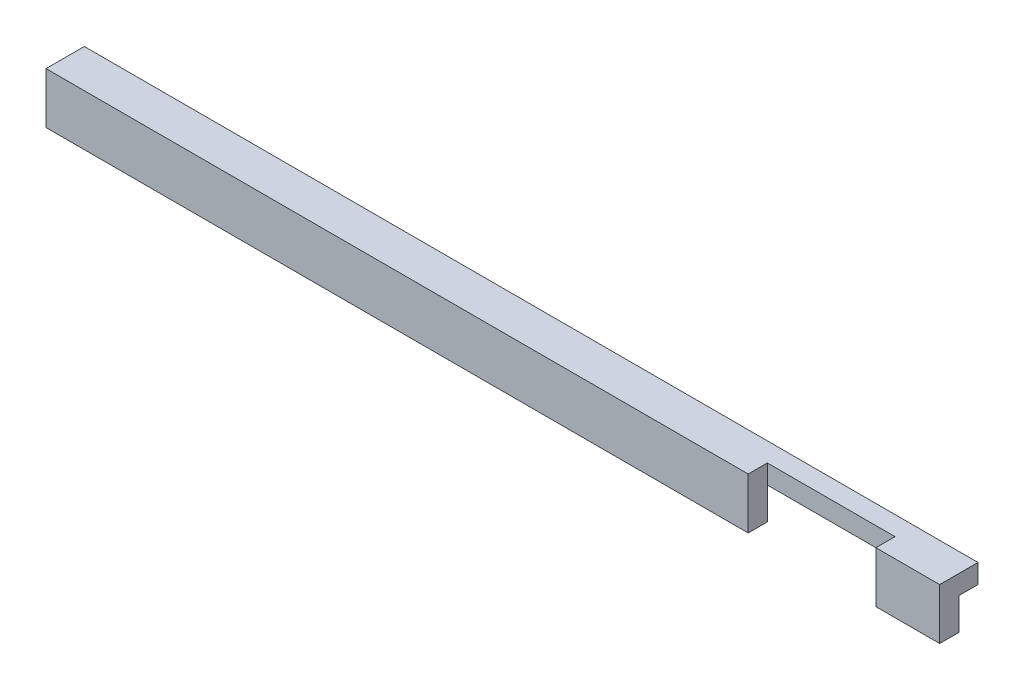
ISO-10303-21;
HEADER;
FILE_DESCRIPTION(('STEP AP214'),'2;1');
FILE_NAME('part.step','',(''),(''),'','','');
FILE_SCHEMA(('AUTOMOTIVE_DESIGN { 1 0 10303 214 1 1 1 1 }'));
ENDSEC;
DATA;
#1=APPLICATION_CONTEXT('core data for automotive mechanical design processes');
#2=APPLICATION_PROTOCOL_DEFINITION('international standard','automotive_design',2000,#1);
#3=PRODUCT_CONTEXT('',#1,'mechanical');
#4=PRODUCT('Part','Part','',(#3));
#5=PRODUCT_RELATED_PRODUCT_CATEGORY('part','',(#4));
#6=PRODUCT_DEFINITION_FORMATION('','',#4);
#7=PRODUCT_DEFINITION_CONTEXT('part definition',#1,'design');
#8=PRODUCT_DEFINITION('design','',#6,#7);
#9=PRODUCT_DEFINITION_SHAPE('','',#8);
#10=(LENGTH_UNIT() NAMED_UNIT(*) SI_UNIT(.MILLI.,.METRE.));
#11=(NAMED_UNIT(*) PLANE_ANGLE_UNIT() SI_UNIT($,.RADIAN.));
#12=(NAMED_UNIT(*) SI_UNIT($,.STERADIAN.) SOLID_ANGLE_UNIT());
#13=UNCERTAINTY_MEASURE_WITH_UNIT(LENGTH_MEASURE(1.E-05),#10,'distance_accuracy_value','');
#14=(GEOMETRIC_REPRESENTATION_CONTEXT(3) GLOBAL_UNCERTAINTY_ASSIGNED_CONTEXT((#13)) GLOBAL_UNIT_ASSIGNED_CONTEXT((#10,
#11,#12)) REPRESENTATION_CONTEXT('',''));
#15=CARTESIAN_POINT('',(0.,0.,0.));
#16=DIRECTION('',(0.,0.,1.));
#17=DIRECTION('',(1.,0.,0.));
#18=AXIS2_PLACEMENT_3D('',#15,#16,#17);
#19=CARTESIAN_POINT('',(0.,0.,0.));
#20=DIRECTION('',(0.,1.,0.));
#21=DIRECTION('',(0.,0.,1.));
#22=AXIS2_PLACEMENT_3D('',#19,#20,#21);
#23=PLANE('',#22);
#24=DIRECTION('',(1.,0.,0.));
#25=VECTOR('',#24,1.);
#26=CARTESIAN_POINT('',(-70.,0.,1.99999999999999));
#27=LINE('',#26,#25);
#28=CARTESIAN_POINT('',(60.,0.,1.99999999999999));
#29=VERTEX_POINT('',#28);
#30=CARTESIAN_POINT('',(70.,0.,1.99999999999999));
#31=VERTEX_POINT('',#30);
#32=EDGE_CURVE('E180',#29,#31,#27,.T.);
#33=ORIENTED_EDGE('',*,*,#32,.F.);
#34=DIRECTION('',(0.,0.,1.));
#35=VECTOR('',#34,1.);
#36=CARTESIAN_POINT('',(60.,0.,-1.00000000000001));
#37=LINE('',#36,#35);
#38=CARTESIAN_POINT('',(60.,0.,-1.00000000000001));
#39=VERTEX_POINT('',#38);
#40=EDGE_CURVE('E148',#39,#29,#37,.T.);
#41=ORIENTED_EDGE('',*,*,#40,.F.);
#42=DIRECTION('',(1.,0.,0.));
#43=VECTOR('',#42,1.);
#44=CARTESIAN_POINT('',(-70.,0.,-1.00000000000001));
#45=LINE('',#44,#43);
#46=CARTESIAN_POINT('',(70.,0.,-1.00000000000001));
#47=VERTEX_POINT('',#46);
#48=EDGE_CURVE('E57',#39,#47,#45,.T.);
#49=ORIENTED_EDGE('',*,*,#48,.T.);
#50=DIRECTION('',(0.,0.,-1.));
#51=VECTOR('',#50,1.);
#52=CARTESIAN_POINT('',(70.,0.,3.99999999999999));
#53=LINE('',#52,#51);
#54=EDGE_CURVE('E192',#31,#47,#53,.T.);
#55=ORIENTED_EDGE('',*,*,#54,.F.);
#56=EDGE_LOOP('',(#33,#41,#49,#55));
#57=FACE_BOUND('',#56,.T.);
#58=ADVANCED_FACE('F34',(#57),#23,.F.);
#59=CARTESIAN_POINT('',(-70.,0.,1.99999999999999));
#60=DIRECTION('',(0.,0.,-1.));
#61=DIRECTION('',(-1.,0.,0.));
#62=AXIS2_PLACEMENT_3D('',#59,#60,#61);
#63=PLANE('',#62);
#64=DIRECTION('',(1.,0.,0.));
#65=VECTOR('',#64,1.);
#66=CARTESIAN_POINT('',(-70.,8.,1.99999999999999));
#67=LINE('',#66,#65);
#68=CARTESIAN_POINT('',(60.,8.,1.99999999999999));
#69=VERTEX_POINT('',#68);
#70=CARTESIAN_POINT('',(70.,8.,1.99999999999999));
#71=VERTEX_POINT('',#70);
#72=EDGE_CURVE('E184',#69,#71,#67,.T.);
#73=ORIENTED_EDGE('',*,*,#72,.F.);
#74=DIRECTION('',(0.,1.,0.));
#75=VECTOR('',#74,1.);
#76=CARTESIAN_POINT('',(60.,8.,1.99999999999999));
#77=LINE('',#76,#75);
#78=EDGE_CURVE('E134',#29,#69,#77,.T.);
#79=ORIENTED_EDGE('',*,*,#78,.F.);
#80=ORIENTED_EDGE('',*,*,#32,.T.);
#81=DIRECTION('',(0.,1.,0.));
#82=VECTOR('',#81,1.);
#83=CARTESIAN_POINT('',(70.,0.,1.99999999999999));
#84=LINE('',#83,#82);
#85=EDGE_CURVE('E150',#31,#71,#84,.T.);
#86=ORIENTED_EDGE('',*,*,#85,.T.);
#87=EDGE_LOOP('',(#73,#79,#80,#86));
#88=FACE_BOUND('',#87,.T.);
#89=ADVANCED_FACE('F231',(#88),#63,.F.);
#90=CARTESIAN_POINT('',(-70.,0.,-1.00000000000001));
#91=DIRECTION('',(0.,0.,1.));
#92=DIRECTION('',(1.,0.,0.));
#93=AXIS2_PLACEMENT_3D('',#90,#91,#92);
#94=PLANE('',#93);
#95=ORIENTED_EDGE('',*,*,#48,.F.);
#96=DIRECTION('',(0.,1.,0.));
#97=VECTOR('',#96,1.);
#98=CARTESIAN_POINT('',(60.,8.,-1.00000000000001));
#99=LINE('',#98,#97);
#100=CARTESIAN_POINT('',(60.,5.,-1.00000000000001));
#101=VERTEX_POINT('',#100);
#102=EDGE_CURVE('E127',#39,#101,#99,.T.);
#103=ORIENTED_EDGE('',*,*,#102,.T.);
#104=DIRECTION('',(1.,0.,0.));
#105=VECTOR('',#104,1.);
#106=CARTESIAN_POINT('',(-70.,5.,-1.00000000000001));
#107=LINE('',#106,#105);
#108=CARTESIAN_POINT('',(70.,5.,-1.00000000000001));
#109=VERTEX_POINT('',#108);
#110=EDGE_CURVE('E175',#101,#109,#107,.T.);
#111=ORIENTED_EDGE('',*,*,#110,.T.);
#112=DIRECTION('',(0.,-1.,0.));
#113=VECTOR('',#112,1.);
#114=CARTESIAN_POINT('',(70.,0.,-1.00000000000001));
#115=LINE('',#114,#113);
#116=EDGE_CURVE('E159',#109,#47,#115,.T.);
#117=ORIENTED_EDGE('',*,*,#116,.T.);
#118=EDGE_LOOP('',(#95,#103,#111,#117));
#119=FACE_BOUND('',#118,.T.);
#120=ADVANCED_FACE('F218',(#119),#94,.F.);
#121=CARTESIAN_POINT('',(-70.,8.,4.00000000000001));
#122=DIRECTION('',(1.,0.,0.));
#123=DIRECTION('',(0.,0.,-1.));
#124=AXIS2_PLACEMENT_3D('',#121,#122,#123);
#125=PLANE('',#124);
#126=DIRECTION('',(0.,0.,1.));
#127=VECTOR('',#126,1.);
#128=CARTESIAN_POINT('',(-70.,5.,-4.00000000000001));
#129=LINE('',#128,#127);
#130=CARTESIAN_POINT('',(-70.,5.,-4.00000000000001));
#131=VERTEX_POINT('',#130);
#132=CARTESIAN_POINT('',(-70.,5.,-1.00000000000001));
#133=VERTEX_POINT('',#132);
#134=EDGE_CURVE('E155',#131,#133,#129,.T.);
#135=ORIENTED_EDGE('',*,*,#134,.T.);
#136=DIRECTION('',(0.,-1.,0.));
#137=VECTOR('',#136,1.);
#138=CARTESIAN_POINT('',(-70.,0.,-1.00000000000001));
#139=LINE('',#138,#137);
#140=CARTESIAN_POINT('',(-70.,0.,-1.00000000000001));
#141=VERTEX_POINT('',#140);
#142=EDGE_CURVE('E158',#133,#141,#139,.T.);
#143=ORIENTED_EDGE('',*,*,#142,.T.);
#144=DIRECTION('',(0.,0.,1.));
#145=VECTOR('',#144,1.);
#146=CARTESIAN_POINT('',(-70.,0.,4.00000000000001));
#147=LINE('',#146,#145);
#148=CARTESIAN_POINT('',(-70.,0.,1.99999999999999));
#149=VERTEX_POINT('',#148);
#150=EDGE_CURVE('E171',#141,#149,#147,.T.);
#151=ORIENTED_EDGE('',*,*,#150,.T.);
#152=DIRECTION('',(0.,1.,0.));
#153=VECTOR('',#152,1.);
#154=CARTESIAN_POINT('',(-70.,0.,1.99999999999999));
#155=LINE('',#154,#153);
#156=CARTESIAN_POINT('',(-70.,8.,1.99999999999999));
#157=VERTEX_POINT('',#156);
#158=EDGE_CURVE('E177',#149,#157,#155,.T.);
#159=ORIENTED_EDGE('',*,*,#158,.T.);
#160=DIRECTION('',(0.,0.,1.));
#161=VECTOR('',#160,1.);
#162=CARTESIAN_POINT('',(-70.,8.,4.00000000000001));
#163=LINE('',#162,#161);
#164=CARTESIAN_POINT('',(-70.,8.,-3.99999999999999));
#165=VERTEX_POINT('',#164);
#166=EDGE_CURVE('E188',#165,#157,#163,.T.);
#167=ORIENTED_EDGE('',*,*,#166,.F.);
#168=DIRECTION('',(0.,-1.,0.));
#169=VECTOR('',#168,1.);
#170=CARTESIAN_POINT('',(-70.,8.,-3.99999999999999));
#171=LINE('',#170,#169);
#172=EDGE_CURVE('E42',#165,#131,#171,.T.);
#173=ORIENTED_EDGE('',*,*,#172,.T.);
#174=EDGE_LOOP('',(#135,#143,#151,#159,#167,#173));
#175=FACE_BOUND('',#174,.T.);
#176=ADVANCED_FACE('F36',(#175),#125,.F.);
#177=CARTESIAN_POINT('',(70.,8.,3.99999999999999));
#178=DIRECTION('',(-1.,0.,0.));
#179=DIRECTION('',(0.,0.,1.));
#180=AXIS2_PLACEMENT_3D('',#177,#178,#179);
#181=PLANE('',#180);
#182=ORIENTED_EDGE('',*,*,#54,.T.);
#183=ORIENTED_EDGE('',*,*,#116,.F.);
#184=DIRECTION('',(0.,0.,1.));
#185=VECTOR('',#184,1.);
#186=CARTESIAN_POINT('',(70.,5.,-4.00000000000001));
#187=LINE('',#186,#185);
#188=CARTESIAN_POINT('',(70.,5.,-4.00000000000001));
#189=VERTEX_POINT('',#188);
#190=EDGE_CURVE('E163',#189,#109,#187,.T.);
#191=ORIENTED_EDGE('',*,*,#190,.F.);
#192=DIRECTION('',(0.,-1.,0.));
#193=VECTOR('',#192,1.);
#194=CARTESIAN_POINT('',(70.,8.,-4.00000000000001));
#195=LINE('',#194,#193);
#196=CARTESIAN_POINT('',(70.,8.,-4.00000000000001));
#197=VERTEX_POINT('',#196);
#198=EDGE_CURVE('E11',#197,#189,#195,.T.);
#199=ORIENTED_EDGE('',*,*,#198,.F.);
#200=DIRECTION('',(0.,0.,-1.));
#201=VECTOR('',#200,1.);
#202=CARTESIAN_POINT('',(70.,8.,3.99999999999999));
#203=LINE('',#202,#201);
#204=EDGE_CURVE('E191',#71,#197,#203,.T.);
#205=ORIENTED_EDGE('',*,*,#204,.F.);
#206=ORIENTED_EDGE('',*,*,#85,.F.);
#207=EDGE_LOOP('',(#182,#183,#191,#199,#205,#206));
#208=FACE_BOUND('',#207,.T.);
#209=ADVANCED_FACE('F214',(#208),#181,.F.);
#210=CARTESIAN_POINT('',(70.,8.,-4.00000000000001));
#211=DIRECTION('',(0.,0.,1.));
#212=DIRECTION('',(1.,0.,0.));
#213=AXIS2_PLACEMENT_3D('',#210,#211,#212);
#214=PLANE('',#213);
#215=ORIENTED_EDGE('',*,*,#198,.T.);
#216=DIRECTION('',(1.,0.,0.));
#217=VECTOR('',#216,1.);
#218=CARTESIAN_POINT('',(-70.,5.,-4.00000000000001));
#219=LINE('',#218,#217);
#220=EDGE_CURVE('E162',#131,#189,#219,.T.);
#221=ORIENTED_EDGE('',*,*,#220,.F.);
#222=ORIENTED_EDGE('',*,*,#172,.F.);
#223=DIRECTION('',(-1.,0.,0.));
#224=VECTOR('',#223,1.);
#225=CARTESIAN_POINT('',(70.,8.,-4.00000000000001));
#226=LINE('',#225,#224);
#227=EDGE_CURVE('E194',#197,#165,#226,.T.);
#228=ORIENTED_EDGE('',*,*,#227,.F.);
#229=EDGE_LOOP('',(#215,#221,#222,#228));
#230=FACE_BOUND('',#229,.T.);
#231=ADVANCED_FACE('F206',(#230),#214,.F.);
#232=CARTESIAN_POINT('',(0.,8.,0.));
#233=DIRECTION('',(0.,1.,0.));
#234=DIRECTION('',(0.,0.,1.));
#235=AXIS2_PLACEMENT_3D('',#232,#233,#234);
#236=PLANE('',#235);
#237=DIRECTION('',(0.,0.,1.));
#238=VECTOR('',#237,1.);
#239=CARTESIAN_POINT('',(60.,8.,-1.00000000000001));
#240=LINE('',#239,#238);
#241=CARTESIAN_POINT('',(60.,8.,-1.00000000000001));
#242=VERTEX_POINT('',#241);
#243=EDGE_CURVE('E131',#242,#69,#240,.T.);
#244=ORIENTED_EDGE('',*,*,#243,.T.);
#245=ORIENTED_EDGE('',*,*,#72,.T.);
#246=ORIENTED_EDGE('',*,*,#204,.T.);
#247=ORIENTED_EDGE('',*,*,#227,.T.);
#248=ORIENTED_EDGE('',*,*,#166,.T.);
#249=CARTESIAN_POINT('',(40.,8.,1.99999999999999));
#250=VERTEX_POINT('',#249);
#251=EDGE_CURVE('E166',#157,#250,#67,.T.);
#252=ORIENTED_EDGE('',*,*,#251,.T.);
#253=DIRECTION('',(0.,0.,1.));
#254=VECTOR('',#253,1.);
#255=CARTESIAN_POINT('',(40.,8.,-1.00000000000001));
#256=LINE('',#255,#254);
#257=CARTESIAN_POINT('',(40.,8.,-1.00000000000001));
#258=VERTEX_POINT('',#257);
#259=EDGE_CURVE('E137',#258,#250,#256,.T.);
#260=ORIENTED_EDGE('',*,*,#259,.F.);
#261=DIRECTION('',(-1.,0.,0.));
#262=VECTOR('',#261,1.);
#263=CARTESIAN_POINT('',(60.,8.,-1.00000000000001));
#264=LINE('',#263,#262);
#265=EDGE_CURVE('E121',#242,#258,#264,.T.);
#266=ORIENTED_EDGE('',*,*,#265,.F.);
#267=EDGE_LOOP('',(#244,#245,#246,#247,#248,#252,#260,#266));
#268=FACE_BOUND('',#267,.T.);
#269=ADVANCED_FACE('F139',(#268),#236,.T.);
#270=CARTESIAN_POINT('',(40.,0.,-1.00000000000001));
#271=VERTEX_POINT('',#270);
#272=EDGE_CURVE('E168',#141,#271,#45,.T.);
#273=ORIENTED_EDGE('',*,*,#272,.T.);
#274=DIRECTION('',(0.,0.,1.));
#275=VECTOR('',#274,1.);
#276=CARTESIAN_POINT('',(40.,0.,-1.00000000000001));
#277=LINE('',#276,#275);
#278=CARTESIAN_POINT('',(40.,0.,1.99999999999999));
#279=VERTEX_POINT('',#278);
#280=EDGE_CURVE('E151',#271,#279,#277,.T.);
#281=ORIENTED_EDGE('',*,*,#280,.T.);
#282=EDGE_CURVE('E185',#149,#279,#27,.T.);
#283=ORIENTED_EDGE('',*,*,#282,.F.);
#284=ORIENTED_EDGE('',*,*,#150,.F.);
#285=EDGE_LOOP('',(#273,#281,#283,#284));
#286=FACE_BOUND('',#285,.T.);
#287=ADVANCED_FACE('F225',(#286),#23,.F.);
#288=ORIENTED_EDGE('',*,*,#282,.T.);
#289=DIRECTION('',(0.,-1.,0.));
#290=VECTOR('',#289,1.);
#291=CARTESIAN_POINT('',(40.,8.,1.99999999999999));
#292=LINE('',#291,#290);
#293=EDGE_CURVE('E128',#250,#279,#292,.T.);
#294=ORIENTED_EDGE('',*,*,#293,.F.);
#295=ORIENTED_EDGE('',*,*,#251,.F.);
#296=ORIENTED_EDGE('',*,*,#158,.F.);
#297=EDGE_LOOP('',(#288,#294,#295,#296));
#298=FACE_BOUND('',#297,.T.);
#299=ADVANCED_FACE('F228',(#298),#63,.F.);
#300=CARTESIAN_POINT('',(40.,5.,-1.00000000000001));
#301=VERTEX_POINT('',#300);
#302=EDGE_CURVE('E172',#133,#301,#107,.T.);
#303=ORIENTED_EDGE('',*,*,#302,.T.);
#304=DIRECTION('',(0.,-1.,0.));
#305=VECTOR('',#304,1.);
#306=CARTESIAN_POINT('',(40.,8.,-1.00000000000001));
#307=LINE('',#306,#305);
#308=EDGE_CURVE('E141',#301,#271,#307,.T.);
#309=ORIENTED_EDGE('',*,*,#308,.T.);
#310=ORIENTED_EDGE('',*,*,#272,.F.);
#311=ORIENTED_EDGE('',*,*,#142,.F.);
#312=EDGE_LOOP('',(#303,#309,#310,#311));
#313=FACE_BOUND('',#312,.T.);
#314=ADVANCED_FACE('F221',(#313),#94,.F.);
#315=CARTESIAN_POINT('',(-70.,5.,-4.00000000000001));
#316=DIRECTION('',(0.,1.,0.));
#317=DIRECTION('',(0.,0.,1.));
#318=AXIS2_PLACEMENT_3D('',#315,#316,#317);
#319=PLANE('',#318);
#320=ORIENTED_EDGE('',*,*,#190,.T.);
#321=ORIENTED_EDGE('',*,*,#110,.F.);
#322=EDGE_CURVE('E124',#301,#101,#107,.T.);
#323=ORIENTED_EDGE('',*,*,#322,.F.);
#324=ORIENTED_EDGE('',*,*,#302,.F.);
#325=ORIENTED_EDGE('',*,*,#134,.F.);
#326=ORIENTED_EDGE('',*,*,#220,.T.);
#327=EDGE_LOOP('',(#320,#321,#323,#324,#325,#326));
#328=FACE_BOUND('',#327,.T.);
#329=ADVANCED_FACE('F210',(#328),#319,.F.);
#330=CARTESIAN_POINT('',(0.,0.,-1.00000000000001));
#331=DIRECTION('',(0.,0.,-1.));
#332=DIRECTION('',(-1.,0.,0.));
#333=AXIS2_PLACEMENT_3D('',#330,#331,#332);
#334=PLANE('',#333);
#335=EDGE_CURVE('E117',#101,#242,#99,.T.);
#336=ORIENTED_EDGE('',*,*,#335,.T.);
#337=ORIENTED_EDGE('',*,*,#265,.T.);
#338=EDGE_CURVE('E49',#258,#301,#307,.T.);
#339=ORIENTED_EDGE('',*,*,#338,.T.);
#340=ORIENTED_EDGE('',*,*,#322,.T.);
#341=EDGE_LOOP('',(#336,#337,#339,#340));
#342=FACE_BOUND('',#341,.T.);
#343=ADVANCED_FACE('F119',(#342),#334,.F.);
#344=CARTESIAN_POINT('',(60.,8.,-1.00000000000001));
#345=DIRECTION('',(1.,0.,0.));
#346=DIRECTION('',(0.,0.,-1.));
#347=AXIS2_PLACEMENT_3D('',#344,#345,#346);
#348=PLANE('',#347);
#349=ORIENTED_EDGE('',*,*,#78,.T.);
#350=ORIENTED_EDGE('',*,*,#243,.F.);
#351=ORIENTED_EDGE('',*,*,#335,.F.);
#352=ORIENTED_EDGE('',*,*,#102,.F.);
#353=ORIENTED_EDGE('',*,*,#40,.T.);
#354=EDGE_LOOP('',(#349,#350,#351,#352,#353));
#355=FACE_BOUND('',#354,.T.);
#356=ADVANCED_FACE('F132',(#355),#348,.F.);
#357=CARTESIAN_POINT('',(40.,8.,-1.00000000000001));
#358=DIRECTION('',(-1.,0.,0.));
#359=DIRECTION('',(0.,0.,1.));
#360=AXIS2_PLACEMENT_3D('',#357,#358,#359);
#361=PLANE('',#360);
#362=ORIENTED_EDGE('',*,*,#293,.T.);
#363=ORIENTED_EDGE('',*,*,#280,.F.);
#364=ORIENTED_EDGE('',*,*,#308,.F.);
#365=ORIENTED_EDGE('',*,*,#338,.F.);
#366=ORIENTED_EDGE('',*,*,#259,.T.);
#367=EDGE_LOOP('',(#362,#363,#364,#365,#366));
#368=FACE_BOUND('',#367,.T.);
#369=ADVANCED_FACE('F311',(#368),#361,.F.);
#370=CLOSED_SHELL('',(#58,#89,#120,#176,#209,#231,#269,#287,#299,#314,#329,#343,#356,#369));
#371=MANIFOLD_SOLID_BREP('B2',#370);
#372=ADVANCED_BREP_SHAPE_REPRESENTATION('',(#18,#371),#14);
#373=SHAPE_DEFINITION_REPRESENTATION(#9,#372);
ENDSEC;
END-ISO-10303-21;
